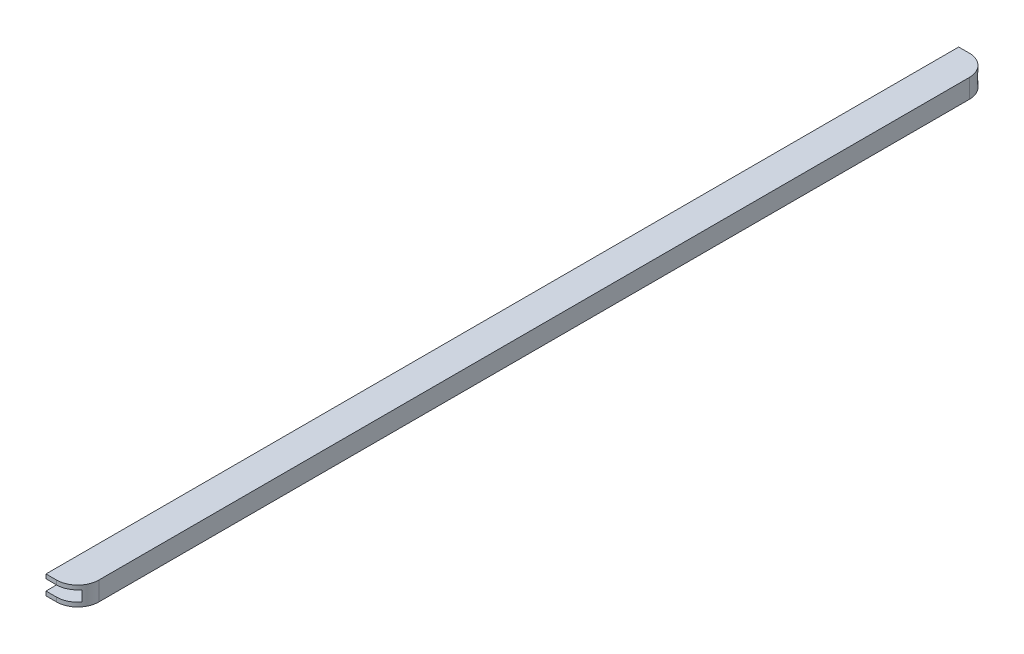
ISO-10303-21;
HEADER;
FILE_DESCRIPTION(('STEP AP214'),'2;1');
FILE_NAME('part.step','',(''),(''),'','','');
FILE_SCHEMA(('AUTOMOTIVE_DESIGN { 1 0 10303 214 1 1 1 1 }'));
ENDSEC;
DATA;
#1=APPLICATION_CONTEXT('core data for automotive mechanical design processes');
#2=APPLICATION_PROTOCOL_DEFINITION('international standard','automotive_design',2000,#1);
#3=PRODUCT_CONTEXT('',#1,'mechanical');
#4=PRODUCT('Part','Part','',(#3));
#5=PRODUCT_RELATED_PRODUCT_CATEGORY('part','',(#4));
#6=PRODUCT_DEFINITION_FORMATION('','',#4);
#7=PRODUCT_DEFINITION_CONTEXT('part definition',#1,'design');
#8=PRODUCT_DEFINITION('design','',#6,#7);
#9=PRODUCT_DEFINITION_SHAPE('','',#8);
#10=(LENGTH_UNIT() NAMED_UNIT(*) SI_UNIT(.MILLI.,.METRE.));
#11=(NAMED_UNIT(*) PLANE_ANGLE_UNIT() SI_UNIT($,.RADIAN.));
#12=(NAMED_UNIT(*) SI_UNIT($,.STERADIAN.) SOLID_ANGLE_UNIT());
#13=UNCERTAINTY_MEASURE_WITH_UNIT(LENGTH_MEASURE(1.E-05),#10,'distance_accuracy_value','');
#14=(GEOMETRIC_REPRESENTATION_CONTEXT(3) GLOBAL_UNCERTAINTY_ASSIGNED_CONTEXT((#13)) GLOBAL_UNIT_ASSIGNED_CONTEXT((#10,
#11,#12)) REPRESENTATION_CONTEXT('',''));
#15=CARTESIAN_POINT('',(0.,0.,0.));
#16=DIRECTION('',(0.,0.,1.));
#17=DIRECTION('',(1.,0.,0.));
#18=AXIS2_PLACEMENT_3D('',#15,#16,#17);
#19=CARTESIAN_POINT('',(-78.135593220339,9.,-35.3813559322034));
#20=DIRECTION('',(0.,-1.,0.));
#21=DIRECTION('',(0.,0.,-1.));
#22=AXIS2_PLACEMENT_3D('',#19,#20,#21);
#23=CYLINDRICAL_SURFACE('',#22,10.);
#24=DIRECTION('',(0.,-1.,0.));
#25=VECTOR('',#24,1.);
#26=CARTESIAN_POINT('',(-78.135593220339,9.,-45.3813559322034));
#27=LINE('',#26,#25);
#28=CARTESIAN_POINT('',(-78.135593220339,9.,-45.3813559322034));
#29=VERTEX_POINT('',#28);
#30=CARTESIAN_POINT('',(-78.135593220339,7.,-45.3813559322034));
#31=VERTEX_POINT('',#30);
#32=EDGE_CURVE('E177',#29,#31,#27,.T.);
#33=ORIENTED_EDGE('',*,*,#32,.F.);
#34=CARTESIAN_POINT('',(-78.135593220339,9.,-35.3813559322034));
#35=DIRECTION('',(0.,1.,0.));
#36=DIRECTION('',(0.,0.,1.));
#37=AXIS2_PLACEMENT_3D('',#34,#35,#36);
#38=CIRCLE('',#37,10.);
#39=CARTESIAN_POINT('',(-68.135593220339,9.,-35.3813559322034));
#40=VERTEX_POINT('',#39);
#41=EDGE_CURVE('E40',#40,#29,#38,.T.);
#42=ORIENTED_EDGE('',*,*,#41,.F.);
#43=DIRECTION('',(0.,-1.,0.));
#44=VECTOR('',#43,1.);
#45=CARTESIAN_POINT('',(-68.135593220339,9.,-35.3813559322034));
#46=LINE('',#45,#44);
#47=CARTESIAN_POINT('',(-68.135593220339,0.,-35.3813559322034));
#48=VERTEX_POINT('',#47);
#49=EDGE_CURVE('E187',#48,#40,#46,.F.);
#50=ORIENTED_EDGE('',*,*,#49,.F.);
#51=CARTESIAN_POINT('',(-78.135593220339,0.,-35.3813559322034));
#52=DIRECTION('',(0.,1.,0.));
#53=DIRECTION('',(0.,0.,1.));
#54=AXIS2_PLACEMENT_3D('',#51,#52,#53);
#55=CIRCLE('',#54,10.);
#56=CARTESIAN_POINT('',(-78.135593220339,0.,-45.3813559322034));
#57=VERTEX_POINT('',#56);
#58=EDGE_CURVE('E11',#57,#48,#55,.F.);
#59=ORIENTED_EDGE('',*,*,#58,.F.);
#60=DIRECTION('',(0.,-1.,0.));
#61=VECTOR('',#60,1.);
#62=CARTESIAN_POINT('',(-78.135593220339,9.,-45.3813559322034));
#63=LINE('',#62,#61);
#64=CARTESIAN_POINT('',(-78.135593220339,2.,-45.3813559322034));
#65=VERTEX_POINT('',#64);
#66=EDGE_CURVE('E175',#65,#57,#63,.T.);
#67=ORIENTED_EDGE('',*,*,#66,.F.);
#68=CARTESIAN_POINT('',(-78.135593220339,2.,-35.3813559322034));
#69=DIRECTION('',(0.,-1.,0.));
#70=DIRECTION('',(0.,0.,-1.));
#71=AXIS2_PLACEMENT_3D('',#68,#69,#70);
#72=CIRCLE('',#71,10.);
#73=CARTESIAN_POINT('',(-70.135593220339,2.,-41.3813559322034));
#74=VERTEX_POINT('',#73);
#75=EDGE_CURVE('E126',#74,#65,#72,.F.);
#76=ORIENTED_EDGE('',*,*,#75,.F.);
#77=DIRECTION('',(0.,-1.,0.));
#78=VECTOR('',#77,1.);
#79=CARTESIAN_POINT('',(-70.135593220339,9.,-41.3813559322034));
#80=LINE('',#79,#78);
#81=CARTESIAN_POINT('',(-70.135593220339,7.,-41.3813559322034));
#82=VERTEX_POINT('',#81);
#83=EDGE_CURVE('E183',#82,#74,#80,.T.);
#84=ORIENTED_EDGE('',*,*,#83,.F.);
#85=CARTESIAN_POINT('',(-78.135593220339,7.,-35.3813559322034));
#86=DIRECTION('',(0.,1.,0.));
#87=DIRECTION('',(0.,0.,1.));
#88=AXIS2_PLACEMENT_3D('',#85,#86,#87);
#89=CIRCLE('',#88,10.);
#90=EDGE_CURVE('E180',#31,#82,#89,.F.);
#91=ORIENTED_EDGE('',*,*,#90,.F.);
#92=EDGE_LOOP('',(#33,#42,#50,#59,#67,#76,#84,#91));
#93=FACE_BOUND('',#92,.T.);
#94=ADVANCED_FACE('F33',(#93),#23,.T.);
#95=CARTESIAN_POINT('',(-83.135593220339,9.,-45.3813559322034));
#96=DIRECTION('',(0.,0.,1.));
#97=DIRECTION('',(1.,0.,0.));
#98=AXIS2_PLACEMENT_3D('',#95,#96,#97);
#99=PLANE('',#98);
#100=DIRECTION('',(-1.,0.,0.));
#101=VECTOR('',#100,1.);
#102=CARTESIAN_POINT('',(-83.135593220339,9.,-45.3813559322034));
#103=LINE('',#102,#101);
#104=CARTESIAN_POINT('',(-83.135593220339,9.,-45.3813559322034));
#105=VERTEX_POINT('',#104);
#106=EDGE_CURVE('E146',#29,#105,#103,.T.);
#107=ORIENTED_EDGE('',*,*,#106,.F.);
#108=ORIENTED_EDGE('',*,*,#32,.T.);
#109=DIRECTION('',(-1.,0.,0.));
#110=VECTOR('',#109,1.);
#111=CARTESIAN_POINT('',(-70.135593220339,7.,-45.3813559322034));
#112=LINE('',#111,#110);
#113=CARTESIAN_POINT('',(-83.135593220339,7.,-45.3813559322034));
#114=VERTEX_POINT('',#113);
#115=EDGE_CURVE('E199',#31,#114,#112,.T.);
#116=ORIENTED_EDGE('',*,*,#115,.T.);
#117=DIRECTION('',(0.,-1.,0.));
#118=VECTOR('',#117,1.);
#119=CARTESIAN_POINT('',(-83.135593220339,9.,-45.3813559322034));
#120=LINE('',#119,#118);
#121=EDGE_CURVE('E145',#105,#114,#120,.T.);
#122=ORIENTED_EDGE('',*,*,#121,.F.);
#123=EDGE_LOOP('',(#107,#108,#116,#122));
#124=FACE_BOUND('',#123,.T.);
#125=ADVANCED_FACE('F197',(#124),#99,.F.);
#126=CARTESIAN_POINT('',(-83.1355932203389,9.,386.618644067797));
#127=DIRECTION('',(0.,0.,-1.));
#128=DIRECTION('',(-1.,0.,0.));
#129=AXIS2_PLACEMENT_3D('',#126,#127,#128);
#130=PLANE('',#129);
#131=DIRECTION('',(1.,0.,0.));
#132=VECTOR('',#131,1.);
#133=CARTESIAN_POINT('',(-83.1355932203389,0.,386.618644067797));
#134=LINE('',#133,#132);
#135=CARTESIAN_POINT('',(-83.1355932203389,0.,386.618644067797));
#136=VERTEX_POINT('',#135);
#137=CARTESIAN_POINT('',(-78.1355932203389,0.,386.618644067797));
#138=VERTEX_POINT('',#137);
#139=EDGE_CURVE('E216',#136,#138,#134,.T.);
#140=ORIENTED_EDGE('',*,*,#139,.T.);
#141=DIRECTION('',(0.,-1.,0.));
#142=VECTOR('',#141,1.);
#143=CARTESIAN_POINT('',(-78.1355932203389,9.,386.618644067797));
#144=LINE('',#143,#142);
#145=CARTESIAN_POINT('',(-78.1355932203389,2.,386.618644067797));
#146=VERTEX_POINT('',#145);
#147=EDGE_CURVE('E164',#138,#146,#144,.F.);
#148=ORIENTED_EDGE('',*,*,#147,.T.);
#149=DIRECTION('',(-1.,0.,0.));
#150=VECTOR('',#149,1.);
#151=CARTESIAN_POINT('',(-70.1355932203389,2.,386.618644067797));
#152=LINE('',#151,#150);
#153=CARTESIAN_POINT('',(-83.1355932203389,2.,386.618644067797));
#154=VERTEX_POINT('',#153);
#155=EDGE_CURVE('E131',#146,#154,#152,.T.);
#156=ORIENTED_EDGE('',*,*,#155,.T.);
#157=DIRECTION('',(0.,-1.,0.));
#158=VECTOR('',#157,1.);
#159=CARTESIAN_POINT('',(-83.1355932203389,9.,386.618644067797));
#160=LINE('',#159,#158);
#161=EDGE_CURVE('E140',#154,#136,#160,.T.);
#162=ORIENTED_EDGE('',*,*,#161,.T.);
#163=EDGE_LOOP('',(#140,#148,#156,#162));
#164=FACE_BOUND('',#163,.T.);
#165=ADVANCED_FACE('F227',(#164),#130,.F.);
#166=CARTESIAN_POINT('',(-83.135593220339,9.,-45.3813559322034));
#167=DIRECTION('',(1.,0.,0.));
#168=DIRECTION('',(0.,0.,-1.));
#169=AXIS2_PLACEMENT_3D('',#166,#167,#168);
#170=PLANE('',#169);
#171=ORIENTED_EDGE('',*,*,#121,.T.);
#172=DIRECTION('',(0.,0.,-1.));
#173=VECTOR('',#172,1.);
#174=CARTESIAN_POINT('',(-83.135593220339,7.,-45.3813559322034));
#175=LINE('',#174,#173);
#176=CARTESIAN_POINT('',(-83.1355932203389,7.,386.618644067797));
#177=VERTEX_POINT('',#176);
#178=EDGE_CURVE('E141',#177,#114,#175,.T.);
#179=ORIENTED_EDGE('',*,*,#178,.F.);
#180=CARTESIAN_POINT('',(-83.1355932203389,9.,386.618644067797));
#181=VERTEX_POINT('',#180);
#182=EDGE_CURVE('E154',#181,#177,#160,.T.);
#183=ORIENTED_EDGE('',*,*,#182,.F.);
#184=DIRECTION('',(0.,0.,1.));
#185=VECTOR('',#184,1.);
#186=CARTESIAN_POINT('',(-83.135593220339,9.,-45.3813559322034));
#187=LINE('',#186,#185);
#188=EDGE_CURVE('E204',#105,#181,#187,.T.);
#189=ORIENTED_EDGE('',*,*,#188,.F.);
#190=EDGE_LOOP('',(#171,#179,#183,#189));
#191=FACE_BOUND('',#190,.T.);
#192=ADVANCED_FACE('F205',(#191),#170,.F.);
#193=ORIENTED_EDGE('',*,*,#161,.F.);
#194=DIRECTION('',(0.,0.,1.));
#195=VECTOR('',#194,1.);
#196=CARTESIAN_POINT('',(-83.135593220339,2.,-45.3813559322034));
#197=LINE('',#196,#195);
#198=CARTESIAN_POINT('',(-83.135593220339,2.,-45.3813559322034));
#199=VERTEX_POINT('',#198);
#200=EDGE_CURVE('E124',#199,#154,#197,.T.);
#201=ORIENTED_EDGE('',*,*,#200,.F.);
#202=CARTESIAN_POINT('',(-83.135593220339,0.,-45.3813559322034));
#203=VERTEX_POINT('',#202);
#204=EDGE_CURVE('E138',#199,#203,#120,.T.);
#205=ORIENTED_EDGE('',*,*,#204,.T.);
#206=DIRECTION('',(0.,0.,1.));
#207=VECTOR('',#206,1.);
#208=CARTESIAN_POINT('',(-83.135593220339,0.,-45.3813559322034));
#209=LINE('',#208,#207);
#210=EDGE_CURVE('E214',#203,#136,#209,.T.);
#211=ORIENTED_EDGE('',*,*,#210,.T.);
#212=EDGE_LOOP('',(#193,#201,#205,#211));
#213=FACE_BOUND('',#212,.T.);
#214=ADVANCED_FACE('F136',(#213),#170,.F.);
#215=DIRECTION('',(-1.,0.,0.));
#216=VECTOR('',#215,1.);
#217=CARTESIAN_POINT('',(-70.1355932203389,7.,386.618644067797));
#218=LINE('',#217,#216);
#219=CARTESIAN_POINT('',(-78.1355932203389,7.,386.618644067797));
#220=VERTEX_POINT('',#219);
#221=EDGE_CURVE('E233',#220,#177,#218,.T.);
#222=ORIENTED_EDGE('',*,*,#221,.F.);
#223=DIRECTION('',(0.,-1.,0.));
#224=VECTOR('',#223,1.);
#225=CARTESIAN_POINT('',(-78.1355932203389,9.,386.618644067797));
#226=LINE('',#225,#224);
#227=CARTESIAN_POINT('',(-78.1355932203389,9.,386.618644067797));
#228=VERTEX_POINT('',#227);
#229=EDGE_CURVE('E162',#220,#228,#226,.F.);
#230=ORIENTED_EDGE('',*,*,#229,.T.);
#231=DIRECTION('',(1.,0.,0.));
#232=VECTOR('',#231,1.);
#233=CARTESIAN_POINT('',(-83.1355932203389,9.,386.618644067797));
#234=LINE('',#233,#232);
#235=EDGE_CURVE('E207',#181,#228,#234,.T.);
#236=ORIENTED_EDGE('',*,*,#235,.F.);
#237=ORIENTED_EDGE('',*,*,#182,.T.);
#238=EDGE_LOOP('',(#222,#230,#236,#237));
#239=FACE_BOUND('',#238,.T.);
#240=ADVANCED_FACE('F247',(#239),#130,.F.);
#241=CARTESIAN_POINT('',(-68.135593220339,9.,-45.3813559322034));
#242=DIRECTION('',(-1.,0.,0.));
#243=DIRECTION('',(0.,0.,1.));
#244=AXIS2_PLACEMENT_3D('',#241,#242,#243);
#245=PLANE('',#244);
#246=DIRECTION('',(0.,0.,-1.));
#247=VECTOR('',#246,1.);
#248=CARTESIAN_POINT('',(-68.135593220339,0.,-45.3813559322034));
#249=LINE('',#248,#247);
#250=CARTESIAN_POINT('',(-68.1355932203389,0.,376.618644067797));
#251=VERTEX_POINT('',#250);
#252=EDGE_CURVE('E210',#251,#48,#249,.T.);
#253=ORIENTED_EDGE('',*,*,#252,.T.);
#254=ORIENTED_EDGE('',*,*,#49,.T.);
#255=DIRECTION('',(0.,0.,-1.));
#256=VECTOR('',#255,1.);
#257=CARTESIAN_POINT('',(-68.135593220339,9.,-45.3813559322034));
#258=LINE('',#257,#256);
#259=CARTESIAN_POINT('',(-68.1355932203389,9.,376.618644067797));
#260=VERTEX_POINT('',#259);
#261=EDGE_CURVE('E149',#260,#40,#258,.T.);
#262=ORIENTED_EDGE('',*,*,#261,.F.);
#263=DIRECTION('',(0.,-1.,0.));
#264=VECTOR('',#263,1.);
#265=CARTESIAN_POINT('',(-68.1355932203389,9.,376.618644067797));
#266=LINE('',#265,#264);
#267=EDGE_CURVE('E157',#260,#251,#266,.T.);
#268=ORIENTED_EDGE('',*,*,#267,.T.);
#269=EDGE_LOOP('',(#253,#254,#262,#268));
#270=FACE_BOUND('',#269,.T.);
#271=ADVANCED_FACE('F220',(#270),#245,.F.);
#272=DIRECTION('',(-1.,0.,0.));
#273=VECTOR('',#272,1.);
#274=CARTESIAN_POINT('',(-70.135593220339,2.,-45.3813559322034));
#275=LINE('',#274,#273);
#276=EDGE_CURVE('E119',#65,#199,#275,.T.);
#277=ORIENTED_EDGE('',*,*,#276,.F.);
#278=ORIENTED_EDGE('',*,*,#66,.T.);
#279=DIRECTION('',(-1.,0.,0.));
#280=VECTOR('',#279,1.);
#281=CARTESIAN_POINT('',(-83.135593220339,0.,-45.3813559322034));
#282=LINE('',#281,#280);
#283=EDGE_CURVE('E144',#57,#203,#282,.T.);
#284=ORIENTED_EDGE('',*,*,#283,.T.);
#285=ORIENTED_EDGE('',*,*,#204,.F.);
#286=EDGE_LOOP('',(#277,#278,#284,#285));
#287=FACE_BOUND('',#286,.T.);
#288=ADVANCED_FACE('F143',(#287),#99,.F.);
#289=CARTESIAN_POINT('',(0.,9.,0.));
#290=DIRECTION('',(0.,1.,0.));
#291=DIRECTION('',(0.,0.,1.));
#292=AXIS2_PLACEMENT_3D('',#289,#290,#291);
#293=PLANE('',#292);
#294=ORIENTED_EDGE('',*,*,#261,.T.);
#295=ORIENTED_EDGE('',*,*,#41,.T.);
#296=ORIENTED_EDGE('',*,*,#106,.T.);
#297=ORIENTED_EDGE('',*,*,#188,.T.);
#298=ORIENTED_EDGE('',*,*,#235,.T.);
#299=CARTESIAN_POINT('',(-78.1355932203389,9.,376.618644067797));
#300=DIRECTION('',(0.,1.,0.));
#301=DIRECTION('',(0.,0.,1.));
#302=AXIS2_PLACEMENT_3D('',#299,#300,#301);
#303=CIRCLE('',#302,10.);
#304=EDGE_CURVE('E173',#228,#260,#303,.T.);
#305=ORIENTED_EDGE('',*,*,#304,.T.);
#306=EDGE_LOOP('',(#294,#295,#296,#297,#298,#305));
#307=FACE_BOUND('',#306,.T.);
#308=ADVANCED_FACE('F190',(#307),#293,.T.);
#309=CARTESIAN_POINT('',(0.,0.,0.));
#310=DIRECTION('',(0.,1.,0.));
#311=DIRECTION('',(0.,0.,1.));
#312=AXIS2_PLACEMENT_3D('',#309,#310,#311);
#313=PLANE('',#312);
#314=ORIENTED_EDGE('',*,*,#283,.F.);
#315=ORIENTED_EDGE('',*,*,#58,.T.);
#316=ORIENTED_EDGE('',*,*,#252,.F.);
#317=CARTESIAN_POINT('',(-78.1355932203389,0.,376.618644067797));
#318=DIRECTION('',(0.,1.,0.));
#319=DIRECTION('',(0.,0.,1.));
#320=AXIS2_PLACEMENT_3D('',#317,#318,#319);
#321=CIRCLE('',#320,10.);
#322=EDGE_CURVE('E160',#251,#138,#321,.F.);
#323=ORIENTED_EDGE('',*,*,#322,.T.);
#324=ORIENTED_EDGE('',*,*,#139,.F.);
#325=ORIENTED_EDGE('',*,*,#210,.F.);
#326=EDGE_LOOP('',(#314,#315,#316,#323,#324,#325));
#327=FACE_BOUND('',#326,.T.);
#328=ADVANCED_FACE('F222',(#327),#313,.F.);
#329=CARTESIAN_POINT('',(-70.135593220339,7.,-45.3813559322034));
#330=DIRECTION('',(0.,1.,0.));
#331=DIRECTION('',(0.,0.,1.));
#332=AXIS2_PLACEMENT_3D('',#329,#330,#331);
#333=PLANE('',#332);
#334=ORIENTED_EDGE('',*,*,#115,.F.);
#335=ORIENTED_EDGE('',*,*,#90,.T.);
#336=DIRECTION('',(0.,0.,-1.));
#337=VECTOR('',#336,1.);
#338=CARTESIAN_POINT('',(-70.135593220339,7.,-45.3813559322034));
#339=LINE('',#338,#337);
#340=CARTESIAN_POINT('',(-70.1355932203389,7.,382.618644067797));
#341=VERTEX_POINT('',#340);
#342=EDGE_CURVE('E132',#341,#82,#339,.T.);
#343=ORIENTED_EDGE('',*,*,#342,.F.);
#344=CARTESIAN_POINT('',(-78.1355932203389,7.,376.618644067797));
#345=DIRECTION('',(0.,1.,0.));
#346=DIRECTION('',(0.,0.,1.));
#347=AXIS2_PLACEMENT_3D('',#344,#345,#346);
#348=CIRCLE('',#347,10.);
#349=EDGE_CURVE('E171',#341,#220,#348,.F.);
#350=ORIENTED_EDGE('',*,*,#349,.T.);
#351=ORIENTED_EDGE('',*,*,#221,.T.);
#352=ORIENTED_EDGE('',*,*,#178,.T.);
#353=EDGE_LOOP('',(#334,#335,#343,#350,#351,#352));
#354=FACE_BOUND('',#353,.T.);
#355=ADVANCED_FACE('F244',(#354),#333,.F.);
#356=CARTESIAN_POINT('',(-70.135593220339,2.,-45.3813559322034));
#357=DIRECTION('',(0.,-1.,0.));
#358=DIRECTION('',(0.,0.,-1.));
#359=AXIS2_PLACEMENT_3D('',#356,#357,#358);
#360=PLANE('',#359);
#361=DIRECTION('',(0.,0.,1.));
#362=VECTOR('',#361,1.);
#363=CARTESIAN_POINT('',(-70.135593220339,2.,-45.3813559322034));
#364=LINE('',#363,#362);
#365=CARTESIAN_POINT('',(-70.1355932203389,2.,382.618644067797));
#366=VERTEX_POINT('',#365);
#367=EDGE_CURVE('E232',#74,#366,#364,.T.);
#368=ORIENTED_EDGE('',*,*,#367,.F.);
#369=ORIENTED_EDGE('',*,*,#75,.T.);
#370=ORIENTED_EDGE('',*,*,#276,.T.);
#371=ORIENTED_EDGE('',*,*,#200,.T.);
#372=ORIENTED_EDGE('',*,*,#155,.F.);
#373=CARTESIAN_POINT('',(-78.1355932203389,2.,376.618644067797));
#374=DIRECTION('',(0.,-1.,0.));
#375=DIRECTION('',(0.,0.,-1.));
#376=AXIS2_PLACEMENT_3D('',#373,#374,#375);
#377=CIRCLE('',#376,10.);
#378=EDGE_CURVE('E166',#146,#366,#377,.F.);
#379=ORIENTED_EDGE('',*,*,#378,.T.);
#380=EDGE_LOOP('',(#368,#369,#370,#371,#372,#379));
#381=FACE_BOUND('',#380,.T.);
#382=ADVANCED_FACE('F122',(#381),#360,.F.);
#383=CARTESIAN_POINT('',(-70.135593220339,0.,0.));
#384=DIRECTION('',(1.,0.,0.));
#385=DIRECTION('',(0.,0.,-1.));
#386=AXIS2_PLACEMENT_3D('',#383,#384,#385);
#387=PLANE('',#386);
#388=ORIENTED_EDGE('',*,*,#342,.T.);
#389=ORIENTED_EDGE('',*,*,#83,.T.);
#390=ORIENTED_EDGE('',*,*,#367,.T.);
#391=DIRECTION('',(0.,-1.,0.));
#392=VECTOR('',#391,1.);
#393=CARTESIAN_POINT('',(-70.1355932203389,2.,382.618644067797));
#394=LINE('',#393,#392);
#395=EDGE_CURVE('E169',#366,#341,#394,.F.);
#396=ORIENTED_EDGE('',*,*,#395,.T.);
#397=EDGE_LOOP('',(#388,#389,#390,#396));
#398=FACE_BOUND('',#397,.T.);
#399=ADVANCED_FACE('F241',(#398),#387,.F.);
#400=CARTESIAN_POINT('',(-78.1355932203389,9.,376.618644067797));
#401=DIRECTION('',(0.,-1.,0.));
#402=DIRECTION('',(0.,0.,-1.));
#403=AXIS2_PLACEMENT_3D('',#400,#401,#402);
#404=CYLINDRICAL_SURFACE('',#403,10.);
#405=ORIENTED_EDGE('',*,*,#378,.F.);
#406=ORIENTED_EDGE('',*,*,#147,.F.);
#407=ORIENTED_EDGE('',*,*,#322,.F.);
#408=ORIENTED_EDGE('',*,*,#267,.F.);
#409=ORIENTED_EDGE('',*,*,#304,.F.);
#410=ORIENTED_EDGE('',*,*,#229,.F.);
#411=ORIENTED_EDGE('',*,*,#349,.F.);
#412=ORIENTED_EDGE('',*,*,#395,.F.);
#413=EDGE_LOOP('',(#405,#406,#407,#408,#409,#410,#411,#412));
#414=FACE_BOUND('',#413,.T.);
#415=ADVANCED_FACE('F229',(#414),#404,.T.);
#416=CLOSED_SHELL('',(#94,#125,#165,#192,#214,#240,#271,#288,#308,#328,#355,#382,#399,#415));
#417=MANIFOLD_SOLID_BREP('B2',#416);
#418=ADVANCED_BREP_SHAPE_REPRESENTATION('',(#18,#417),#14);
#419=SHAPE_DEFINITION_REPRESENTATION(#9,#418);
ENDSEC;
END-ISO-10303-21;
